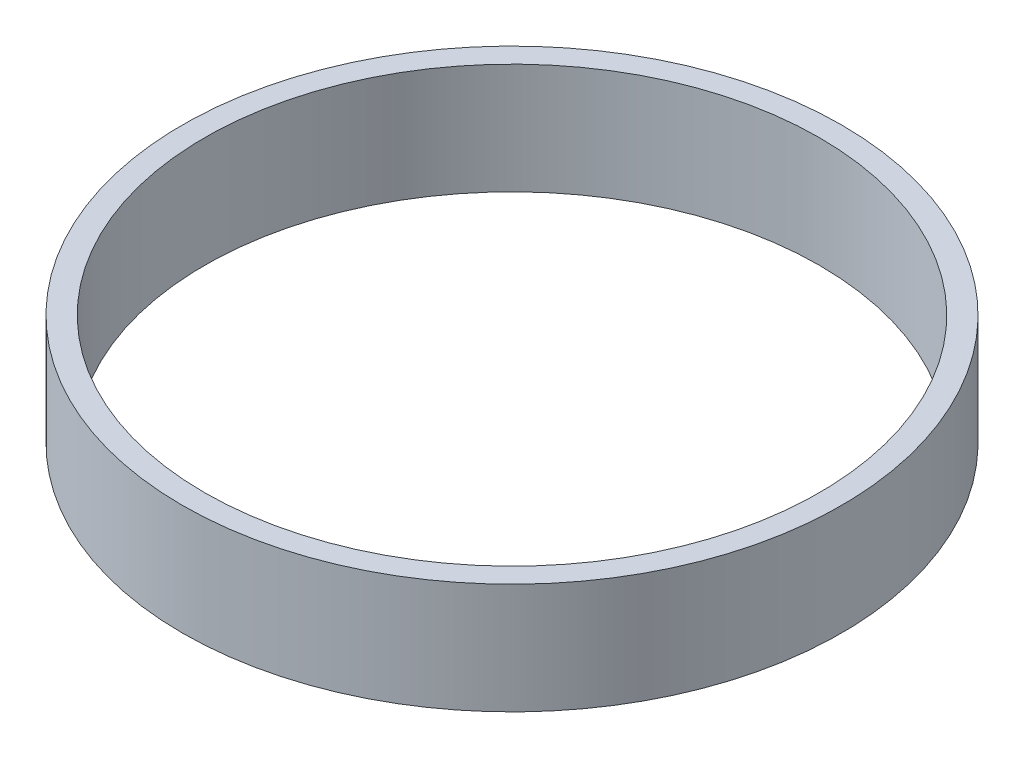
ISO-10303-21;
HEADER;
FILE_DESCRIPTION(('STEP AP214'),'2;1');
FILE_NAME('part.step','',(''),(''),'','','');
FILE_SCHEMA(('AUTOMOTIVE_DESIGN { 1 0 10303 214 1 1 1 1 }'));
ENDSEC;
DATA;
#1=APPLICATION_CONTEXT('core data for automotive mechanical design processes');
#2=APPLICATION_PROTOCOL_DEFINITION('international standard','automotive_design',2000,#1);
#3=PRODUCT_CONTEXT('',#1,'mechanical');
#4=PRODUCT('Part','Part','',(#3));
#5=PRODUCT_RELATED_PRODUCT_CATEGORY('part','',(#4));
#6=PRODUCT_DEFINITION_FORMATION('','',#4);
#7=PRODUCT_DEFINITION_CONTEXT('part definition',#1,'design');
#8=PRODUCT_DEFINITION('design','',#6,#7);
#9=PRODUCT_DEFINITION_SHAPE('','',#8);
#10=(LENGTH_UNIT() NAMED_UNIT(*) SI_UNIT(.MILLI.,.METRE.));
#11=(NAMED_UNIT(*) PLANE_ANGLE_UNIT() SI_UNIT($,.RADIAN.));
#12=(NAMED_UNIT(*) SI_UNIT($,.STERADIAN.) SOLID_ANGLE_UNIT());
#13=UNCERTAINTY_MEASURE_WITH_UNIT(LENGTH_MEASURE(1.E-05),#10,'distance_accuracy_value','');
#14=(GEOMETRIC_REPRESENTATION_CONTEXT(3) GLOBAL_UNCERTAINTY_ASSIGNED_CONTEXT((#13)) GLOBAL_UNIT_ASSIGNED_CONTEXT((#10,
#11,#12)) REPRESENTATION_CONTEXT('',''));
#15=CARTESIAN_POINT('',(0.,0.,0.));
#16=DIRECTION('',(0.,0.,1.));
#17=DIRECTION('',(1.,0.,0.));
#18=AXIS2_PLACEMENT_3D('',#15,#16,#17);
#19=CARTESIAN_POINT('',(99.4149185637371,10.,-12.3898000836178));
#20=DIRECTION('',(0.,1.,0.));
#21=DIRECTION('',(0.,0.,1.));
#22=AXIS2_PLACEMENT_3D('',#19,#20,#21);
#23=PLANE('',#22);
#24=CARTESIAN_POINT('',(99.4149185637371,10.,-12.3898000836178));
#25=DIRECTION('',(0.,1.,0.));
#26=DIRECTION('',(0.,0.,1.));
#27=AXIS2_PLACEMENT_3D('',#24,#25,#26);
#28=CIRCLE('',#27,29.8);
#29=CARTESIAN_POINT('',(99.4149185637371,10.,17.4101999163822));
#30=VERTEX_POINT('',#29);
#31=EDGE_CURVE('E10',#30,#30,#28,.T.);
#32=ORIENTED_EDGE('',*,*,#31,.T.);
#33=EDGE_LOOP('',(#32));
#34=FACE_BOUND('',#33,.T.);
#35=CARTESIAN_POINT('',(99.4149185637371,10.,-12.3898000836178));
#36=DIRECTION('',(0.,1.,0.));
#37=DIRECTION('',(0.,0.,1.));
#38=AXIS2_PLACEMENT_3D('',#35,#36,#37);
#39=CIRCLE('',#38,27.8);
#40=CARTESIAN_POINT('',(99.4149185637371,10.,15.4101999163822));
#41=VERTEX_POINT('',#40);
#42=EDGE_CURVE('E47',#41,#41,#39,.T.);
#43=ORIENTED_EDGE('',*,*,#42,.F.);
#44=EDGE_LOOP('',(#43));
#45=FACE_BOUND('',#44,.T.);
#46=ADVANCED_FACE('F36',(#34,#45),#23,.T.);
#47=CARTESIAN_POINT('',(99.4149185637371,0.,-12.3898000836178));
#48=DIRECTION('',(0.,1.,0.));
#49=DIRECTION('',(0.,0.,1.));
#50=AXIS2_PLACEMENT_3D('',#47,#48,#49);
#51=PLANE('',#50);
#52=CARTESIAN_POINT('',(99.4149185637371,0.,-12.3898000836178));
#53=DIRECTION('',(0.,1.,0.));
#54=DIRECTION('',(0.,0.,1.));
#55=AXIS2_PLACEMENT_3D('',#52,#53,#54);
#56=CIRCLE('',#55,29.8);
#57=CARTESIAN_POINT('',(99.4149185637371,0.,17.4101999163822));
#58=VERTEX_POINT('',#57);
#59=EDGE_CURVE('E40',#58,#58,#56,.T.);
#60=ORIENTED_EDGE('',*,*,#59,.F.);
#61=EDGE_LOOP('',(#60));
#62=FACE_BOUND('',#61,.T.);
#63=CARTESIAN_POINT('',(99.4149185637371,0.,-12.3898000836178));
#64=DIRECTION('',(0.,1.,0.));
#65=DIRECTION('',(0.,0.,1.));
#66=AXIS2_PLACEMENT_3D('',#63,#64,#65);
#67=CIRCLE('',#66,27.8);
#68=CARTESIAN_POINT('',(99.4149185637371,0.,15.4101999163822));
#69=VERTEX_POINT('',#68);
#70=EDGE_CURVE('E49',#69,#69,#67,.T.);
#71=ORIENTED_EDGE('',*,*,#70,.T.);
#72=EDGE_LOOP('',(#71));
#73=FACE_BOUND('',#72,.T.);
#74=ADVANCED_FACE('F59',(#62,#73),#51,.F.);
#75=CARTESIAN_POINT('',(99.4149185637371,10.,-12.3898000836178));
#76=DIRECTION('',(0.,-1.,0.));
#77=DIRECTION('',(0.,0.,-1.));
#78=AXIS2_PLACEMENT_3D('',#75,#76,#77);
#79=CYLINDRICAL_SURFACE('',#78,29.8);
#80=ORIENTED_EDGE('',*,*,#31,.F.);
#81=EDGE_LOOP('',(#80));
#82=FACE_BOUND('',#81,.T.);
#83=ORIENTED_EDGE('',*,*,#59,.T.);
#84=EDGE_LOOP('',(#83));
#85=FACE_BOUND('',#84,.T.);
#86=ADVANCED_FACE('F38',(#82,#85),#79,.T.);
#87=CARTESIAN_POINT('',(99.4149185637371,10.,-12.3898000836178));
#88=DIRECTION('',(0.,-1.,0.));
#89=DIRECTION('',(0.,0.,-1.));
#90=AXIS2_PLACEMENT_3D('',#87,#88,#89);
#91=CYLINDRICAL_SURFACE('',#90,27.8);
#92=ORIENTED_EDGE('',*,*,#42,.T.);
#93=EDGE_LOOP('',(#92));
#94=FACE_BOUND('',#93,.T.);
#95=ORIENTED_EDGE('',*,*,#70,.F.);
#96=EDGE_LOOP('',(#95));
#97=FACE_BOUND('',#96,.T.);
#98=ADVANCED_FACE('F55',(#94,#97),#91,.F.);
#99=CLOSED_SHELL('',(#46,#74,#86,#98));
#100=MANIFOLD_SOLID_BREP('B2',#99);
#101=ADVANCED_BREP_SHAPE_REPRESENTATION('',(#18,#100),#14);
#102=SHAPE_DEFINITION_REPRESENTATION(#9,#101);
ENDSEC;
END-ISO-10303-21;
